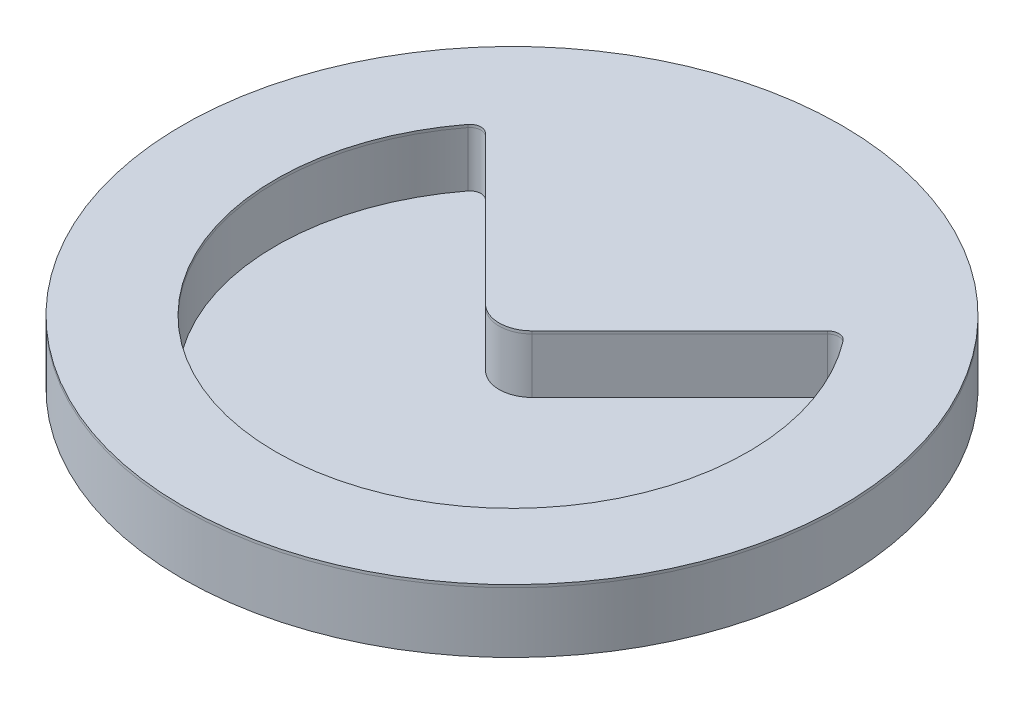
ISO-10303-21;
HEADER;
FILE_DESCRIPTION(('STEP AP214'),'2;1');
FILE_NAME('part.step','',(''),(''),'','','');
FILE_SCHEMA(('AUTOMOTIVE_DESIGN { 1 0 10303 214 1 1 1 1 }'));
ENDSEC;
DATA;
#1=APPLICATION_CONTEXT('core data for automotive mechanical design processes');
#2=APPLICATION_PROTOCOL_DEFINITION('international standard','automotive_design',2000,#1);
#3=PRODUCT_CONTEXT('',#1,'mechanical');
#4=PRODUCT('Part','Part','',(#3));
#5=PRODUCT_RELATED_PRODUCT_CATEGORY('part','',(#4));
#6=PRODUCT_DEFINITION_FORMATION('','',#4);
#7=PRODUCT_DEFINITION_CONTEXT('part definition',#1,'design');
#8=PRODUCT_DEFINITION('design','',#6,#7);
#9=PRODUCT_DEFINITION_SHAPE('','',#8);
#10=(LENGTH_UNIT() NAMED_UNIT(*) SI_UNIT(.MILLI.,.METRE.));
#11=(NAMED_UNIT(*) PLANE_ANGLE_UNIT() SI_UNIT($,.RADIAN.));
#12=(NAMED_UNIT(*) SI_UNIT($,.STERADIAN.) SOLID_ANGLE_UNIT());
#13=UNCERTAINTY_MEASURE_WITH_UNIT(LENGTH_MEASURE(1.E-05),#10,'distance_accuracy_value','');
#14=(GEOMETRIC_REPRESENTATION_CONTEXT(3) GLOBAL_UNCERTAINTY_ASSIGNED_CONTEXT((#13)) GLOBAL_UNIT_ASSIGNED_CONTEXT((#10,
#11,#12)) REPRESENTATION_CONTEXT('',''));
#15=CARTESIAN_POINT('',(0.,0.,0.));
#16=DIRECTION('',(0.,0.,1.));
#17=DIRECTION('',(1.,0.,0.));
#18=AXIS2_PLACEMENT_3D('',#15,#16,#17);
#19=CARTESIAN_POINT('',(0.,10.5,0.));
#20=DIRECTION('',(0.,1.,0.));
#21=DIRECTION('',(0.,0.,1.));
#22=AXIS2_PLACEMENT_3D('',#19,#20,#21);
#23=PLANE('',#22);
#24=CARTESIAN_POINT('',(0.,10.5,0.));
#25=DIRECTION('',(0.,1.,0.));
#26=DIRECTION('',(0.,0.,1.));
#27=AXIS2_PLACEMENT_3D('',#24,#25,#26);
#28=CIRCLE('',#27,60.);
#29=CARTESIAN_POINT('',(0.,10.5,60.));
#30=VERTEX_POINT('',#29);
#31=EDGE_CURVE('E13',#30,#30,#28,.T.);
#32=ORIENTED_EDGE('',*,*,#31,.T.);
#33=EDGE_LOOP('',(#32));
#34=FACE_BOUND('',#33,.T.);
#35=DIRECTION('',(-0.707106781186546,0.,-0.707106781186548));
#36=VECTOR('',#35,1.);
#37=CARTESIAN_POINT('',(-4.24264068711927,10.5,0.585786437626902));
#38=LINE('',#37,#36);
#39=CARTESIAN_POINT('',(-4.24264068711927,10.5,0.585786437626902));
#40=VERTEX_POINT('',#39);
#41=CARTESIAN_POINT('',(-31.1517003305389,10.5,-26.3232732057928));
#42=VERTEX_POINT('',#41);
#43=EDGE_CURVE('E234',#40,#42,#38,.T.);
#44=ORIENTED_EDGE('',*,*,#43,.F.);
#45=CARTESIAN_POINT('',(0.,10.5,-3.65685424949237));
#46=DIRECTION('',(0.,-1.,0.));
#47=DIRECTION('',(0.,0.,1.));
#48=AXIS2_PLACEMENT_3D('',#45,#46,#47);
#49=CIRCLE('',#48,5.99999999999999);
#50=CARTESIAN_POINT('',(4.24264068711929,10.5,0.585786437626899));
#51=VERTEX_POINT('',#50);
#52=EDGE_CURVE('E226',#51,#40,#49,.T.);
#53=ORIENTED_EDGE('',*,*,#52,.F.);
#54=DIRECTION('',(-0.707106781186546,0.,0.707106781186549));
#55=VECTOR('',#54,1.);
#56=CARTESIAN_POINT('',(31.1517003305389,10.5,-26.3232732057928));
#57=LINE('',#56,#55);
#58=CARTESIAN_POINT('',(31.1517003305389,10.5,-26.3232732057928));
#59=VERTEX_POINT('',#58);
#60=EDGE_CURVE('E254',#59,#51,#57,.T.);
#61=ORIENTED_EDGE('',*,*,#60,.F.);
#62=CARTESIAN_POINT('',(32.565913892912,10.5,-24.9090596434197));
#63=DIRECTION('',(0.,1.,0.));
#64=DIRECTION('',(0.,0.,1.));
#65=AXIS2_PLACEMENT_3D('',#62,#63,#64);
#66=CIRCLE('',#65,2.00000000000001);
#67=CARTESIAN_POINT('',(34.1544950584199,10.5,-26.1241357235866));
#68=VERTEX_POINT('',#67);
#69=EDGE_CURVE('E252',#68,#59,#66,.T.);
#70=ORIENTED_EDGE('',*,*,#69,.F.);
#71=CARTESIAN_POINT('',(0.,10.5,0.));
#72=DIRECTION('',(0.,1.,0.));
#73=DIRECTION('',(0.,0.,1.));
#74=AXIS2_PLACEMENT_3D('',#71,#72,#73);
#75=CIRCLE('',#74,43.);
#76=CARTESIAN_POINT('',(-34.1544950584199,10.5,-26.1241357235865));
#77=VERTEX_POINT('',#76);
#78=EDGE_CURVE('E248',#77,#68,#75,.T.);
#79=ORIENTED_EDGE('',*,*,#78,.F.);
#80=CARTESIAN_POINT('',(-32.565913892912,10.5,-24.9090596434197));
#81=DIRECTION('',(0.,1.,0.));
#82=DIRECTION('',(0.,0.,1.));
#83=AXIS2_PLACEMENT_3D('',#80,#81,#82);
#84=CIRCLE('',#83,2.00000000000001);
#85=EDGE_CURVE('E246',#42,#77,#84,.T.);
#86=ORIENTED_EDGE('',*,*,#85,.F.);
#87=EDGE_LOOP('',(#44,#53,#61,#70,#79,#86));
#88=FACE_BOUND('',#87,.T.);
#89=ADVANCED_FACE('F173',(#34,#88),#23,.T.);
#90=CARTESIAN_POINT('',(0.,10.,0.));
#91=DIRECTION('',(0.,1.,0.));
#92=DIRECTION('',(0.,0.,1.));
#93=AXIS2_PLACEMENT_3D('',#90,#91,#92);
#94=PLANE('',#93);
#95=CARTESIAN_POINT('',(0.,10.,0.));
#96=DIRECTION('',(0.,1.,0.));
#97=DIRECTION('',(0.,0.,1.));
#98=AXIS2_PLACEMENT_3D('',#95,#96,#97);
#99=CIRCLE('',#98,60.);
#100=CARTESIAN_POINT('',(0.,10.,60.));
#101=VERTEX_POINT('',#100);
#102=EDGE_CURVE('E177',#101,#101,#99,.T.);
#103=ORIENTED_EDGE('',*,*,#102,.F.);
#104=EDGE_LOOP('',(#103));
#105=FACE_BOUND('',#104,.T.);
#106=CARTESIAN_POINT('',(0.,10.,-3.65685424949237));
#107=DIRECTION('',(0.,-1.,0.));
#108=DIRECTION('',(0.,0.,1.));
#109=AXIS2_PLACEMENT_3D('',#106,#107,#108);
#110=CIRCLE('',#109,5.99999999999999);
#111=CARTESIAN_POINT('',(4.24264068711929,10.,0.585786437626896));
#112=VERTEX_POINT('',#111);
#113=CARTESIAN_POINT('',(-4.24264068711927,10.,0.585786437626902));
#114=VERTEX_POINT('',#113);
#115=EDGE_CURVE('E196',#112,#114,#110,.T.);
#116=ORIENTED_EDGE('',*,*,#115,.T.);
#117=DIRECTION('',(-0.707106781186546,0.,-0.707106781186548));
#118=VECTOR('',#117,1.);
#119=CARTESIAN_POINT('',(-4.24264068711927,10.,0.585786437626902));
#120=LINE('',#119,#118);
#121=CARTESIAN_POINT('',(-31.1517003305389,10.,-26.3232732057928));
#122=VERTEX_POINT('',#121);
#123=EDGE_CURVE('E241',#114,#122,#120,.T.);
#124=ORIENTED_EDGE('',*,*,#123,.T.);
#125=CARTESIAN_POINT('',(-32.565913892912,10.,-24.9090596434197));
#126=DIRECTION('',(0.,1.,0.));
#127=DIRECTION('',(0.,0.,1.));
#128=AXIS2_PLACEMENT_3D('',#125,#126,#127);
#129=CIRCLE('',#128,2.00000000000001);
#130=CARTESIAN_POINT('',(-34.1544950584199,10.,-26.1241357235865));
#131=VERTEX_POINT('',#130);
#132=EDGE_CURVE('E258',#122,#131,#129,.T.);
#133=ORIENTED_EDGE('',*,*,#132,.T.);
#134=CARTESIAN_POINT('',(0.,10.,0.));
#135=DIRECTION('',(0.,1.,0.));
#136=DIRECTION('',(0.,0.,1.));
#137=AXIS2_PLACEMENT_3D('',#134,#135,#136);
#138=CIRCLE('',#137,43.);
#139=CARTESIAN_POINT('',(34.1544950584199,10.,-26.1241357235866));
#140=VERTEX_POINT('',#139);
#141=EDGE_CURVE('E261',#131,#140,#138,.T.);
#142=ORIENTED_EDGE('',*,*,#141,.T.);
#143=CARTESIAN_POINT('',(32.565913892912,10.,-24.9090596434197));
#144=DIRECTION('',(0.,1.,0.));
#145=DIRECTION('',(0.,0.,1.));
#146=AXIS2_PLACEMENT_3D('',#143,#144,#145);
#147=CIRCLE('',#146,2.00000000000001);
#148=CARTESIAN_POINT('',(31.1517003305389,10.,-26.3232732057928));
#149=VERTEX_POINT('',#148);
#150=EDGE_CURVE('E264',#140,#149,#147,.T.);
#151=ORIENTED_EDGE('',*,*,#150,.T.);
#152=DIRECTION('',(-0.707106781186546,0.,0.707106781186549));
#153=VECTOR('',#152,1.);
#154=CARTESIAN_POINT('',(31.1517003305389,10.,-26.3232732057928));
#155=LINE('',#154,#153);
#156=EDGE_CURVE('E235',#149,#112,#155,.T.);
#157=ORIENTED_EDGE('',*,*,#156,.T.);
#158=EDGE_LOOP('',(#116,#124,#133,#142,#151,#157));
#159=FACE_BOUND('',#158,.T.);
#160=ADVANCED_FACE('F281',(#105,#159),#94,.F.);
#161=CARTESIAN_POINT('',(0.,10.5,0.));
#162=DIRECTION('',(0.,-1.,0.));
#163=DIRECTION('',(0.,0.,-1.));
#164=AXIS2_PLACEMENT_3D('',#161,#162,#163);
#165=CYLINDRICAL_SURFACE('',#164,60.);
#166=ORIENTED_EDGE('',*,*,#31,.F.);
#167=EDGE_LOOP('',(#166));
#168=FACE_BOUND('',#167,.T.);
#169=ORIENTED_EDGE('',*,*,#102,.T.);
#170=EDGE_LOOP('',(#169));
#171=FACE_BOUND('',#170,.T.);
#172=ADVANCED_FACE('F175',(#168,#171),#165,.T.);
#173=CARTESIAN_POINT('',(0.,10.5,-3.65685424949237));
#174=DIRECTION('',(0.,-1.,0.));
#175=DIRECTION('',(0.,0.,-1.));
#176=AXIS2_PLACEMENT_3D('',#173,#174,#175);
#177=CYLINDRICAL_SURFACE('',#176,5.99999999999999);
#178=ORIENTED_EDGE('',*,*,#115,.F.);
#179=DIRECTION('',(0.,-1.,0.));
#180=VECTOR('',#179,1.);
#181=CARTESIAN_POINT('',(4.24264068711929,10.5,0.585786437626899));
#182=LINE('',#181,#180);
#183=EDGE_CURVE('E230',#51,#112,#182,.T.);
#184=ORIENTED_EDGE('',*,*,#183,.F.);
#185=ORIENTED_EDGE('',*,*,#52,.T.);
#186=DIRECTION('',(0.,-1.,0.));
#187=VECTOR('',#186,1.);
#188=CARTESIAN_POINT('',(-4.24264068711927,10.5,0.585786437626902));
#189=LINE('',#188,#187);
#190=EDGE_CURVE('E229',#40,#114,#189,.T.);
#191=ORIENTED_EDGE('',*,*,#190,.T.);
#192=EDGE_LOOP('',(#178,#184,#185,#191));
#193=FACE_BOUND('',#192,.T.);
#194=ADVANCED_FACE('F228',(#193),#177,.T.);
#195=CARTESIAN_POINT('',(-4.24264068711927,10.5,0.585786437626902));
#196=DIRECTION('',(-0.707106781186549,0.,0.707106781186547));
#197=DIRECTION('',(0.707106781186546,0.,0.707106781186549));
#198=AXIS2_PLACEMENT_3D('',#195,#196,#197);
#199=PLANE('',#198);
#200=ORIENTED_EDGE('',*,*,#123,.F.);
#201=ORIENTED_EDGE('',*,*,#190,.F.);
#202=ORIENTED_EDGE('',*,*,#43,.T.);
#203=DIRECTION('',(0.,-1.,0.));
#204=VECTOR('',#203,1.);
#205=CARTESIAN_POINT('',(-31.1517003305389,10.5,-26.3232732057928));
#206=LINE('',#205,#204);
#207=EDGE_CURVE('E242',#42,#122,#206,.T.);
#208=ORIENTED_EDGE('',*,*,#207,.T.);
#209=EDGE_LOOP('',(#200,#201,#202,#208));
#210=FACE_BOUND('',#209,.T.);
#211=ADVANCED_FACE('F238',(#210),#199,.T.);
#212=CARTESIAN_POINT('',(-32.565913892912,10.5,-24.9090596434197));
#213=DIRECTION('',(0.,-1.,0.));
#214=DIRECTION('',(0.,0.,-1.));
#215=AXIS2_PLACEMENT_3D('',#212,#213,#214);
#216=CYLINDRICAL_SURFACE('',#215,2.00000000000001);
#217=ORIENTED_EDGE('',*,*,#132,.F.);
#218=ORIENTED_EDGE('',*,*,#207,.F.);
#219=ORIENTED_EDGE('',*,*,#85,.T.);
#220=DIRECTION('',(0.,-1.,0.));
#221=VECTOR('',#220,1.);
#222=CARTESIAN_POINT('',(-34.1544950584199,10.5,-26.1241357235865));
#223=LINE('',#222,#221);
#224=EDGE_CURVE('E273',#77,#131,#223,.T.);
#225=ORIENTED_EDGE('',*,*,#224,.T.);
#226=EDGE_LOOP('',(#217,#218,#219,#225));
#227=FACE_BOUND('',#226,.T.);
#228=ADVANCED_FACE('F277',(#227),#216,.F.);
#229=CARTESIAN_POINT('',(0.,10.5,0.));
#230=DIRECTION('',(0.,-1.,0.));
#231=DIRECTION('',(0.,0.,-1.));
#232=AXIS2_PLACEMENT_3D('',#229,#230,#231);
#233=CYLINDRICAL_SURFACE('',#232,43.);
#234=ORIENTED_EDGE('',*,*,#141,.F.);
#235=ORIENTED_EDGE('',*,*,#224,.F.);
#236=ORIENTED_EDGE('',*,*,#78,.T.);
#237=DIRECTION('',(0.,-1.,0.));
#238=VECTOR('',#237,1.);
#239=CARTESIAN_POINT('',(34.1544950584199,10.5,-26.1241357235866));
#240=LINE('',#239,#238);
#241=EDGE_CURVE('E271',#68,#140,#240,.T.);
#242=ORIENTED_EDGE('',*,*,#241,.T.);
#243=EDGE_LOOP('',(#234,#235,#236,#242));
#244=FACE_BOUND('',#243,.T.);
#245=ADVANCED_FACE('F289',(#244),#233,.F.);
#246=CARTESIAN_POINT('',(32.565913892912,10.5,-24.9090596434197));
#247=DIRECTION('',(0.,-1.,0.));
#248=DIRECTION('',(0.,0.,-1.));
#249=AXIS2_PLACEMENT_3D('',#246,#247,#248);
#250=CYLINDRICAL_SURFACE('',#249,2.00000000000001);
#251=ORIENTED_EDGE('',*,*,#150,.F.);
#252=ORIENTED_EDGE('',*,*,#241,.F.);
#253=ORIENTED_EDGE('',*,*,#69,.T.);
#254=DIRECTION('',(0.,-1.,0.));
#255=VECTOR('',#254,1.);
#256=CARTESIAN_POINT('',(31.1517003305389,10.5,-26.3232732057928));
#257=LINE('',#256,#255);
#258=EDGE_CURVE('E188',#59,#149,#257,.T.);
#259=ORIENTED_EDGE('',*,*,#258,.T.);
#260=EDGE_LOOP('',(#251,#252,#253,#259));
#261=FACE_BOUND('',#260,.T.);
#262=ADVANCED_FACE('F287',(#261),#250,.F.);
#263=CARTESIAN_POINT('',(31.1517003305389,10.5,-26.3232732057928));
#264=DIRECTION('',(0.707106781186549,0.,0.707106781186546));
#265=DIRECTION('',(0.707106781186546,0.,-0.707106781186549));
#266=AXIS2_PLACEMENT_3D('',#263,#264,#265);
#267=PLANE('',#266);
#268=ORIENTED_EDGE('',*,*,#156,.F.);
#269=ORIENTED_EDGE('',*,*,#258,.F.);
#270=ORIENTED_EDGE('',*,*,#60,.T.);
#271=ORIENTED_EDGE('',*,*,#183,.T.);
#272=EDGE_LOOP('',(#268,#269,#270,#271));
#273=FACE_BOUND('',#272,.T.);
#274=ADVANCED_FACE('F283',(#273),#267,.T.);
#275=CLOSED_SHELL('',(#89,#160,#172,#194,#211,#228,#245,#262,#274));
#276=MANIFOLD_SOLID_BREP('B2',#275);
#277=CARTESIAN_POINT('',(0.,10.,0.));
#278=DIRECTION('',(0.,1.,0.));
#279=DIRECTION('',(0.,0.,1.));
#280=AXIS2_PLACEMENT_3D('',#277,#278,#279);
#281=PLANE('',#280);
#282=CARTESIAN_POINT('',(0.,10.,0.));
#283=DIRECTION('',(0.,1.,0.));
#284=DIRECTION('',(0.,0.,1.));
#285=AXIS2_PLACEMENT_3D('',#282,#283,#284);
#286=CIRCLE('',#285,60.);
#287=CARTESIAN_POINT('',(0.,10.,60.));
#288=VERTEX_POINT('',#287);
#289=EDGE_CURVE('E171',#288,#288,#286,.T.);
#290=ORIENTED_EDGE('',*,*,#289,.T.);
#291=EDGE_LOOP('',(#290));
#292=FACE_BOUND('',#291,.T.);
#293=CARTESIAN_POINT('',(0.,10.,0.));
#294=DIRECTION('',(0.,1.,0.));
#295=DIRECTION('',(1.,0.,0.));
#296=AXIS2_PLACEMENT_3D('',#293,#294,#295);
#297=CIRCLE('',#296,58.);
#298=CARTESIAN_POINT('',(58.,10.,0.));
#299=VERTEX_POINT('',#298);
#300=EDGE_CURVE('E378',#299,#299,#297,.T.);
#301=ORIENTED_EDGE('',*,*,#300,.F.);
#302=EDGE_LOOP('',(#301));
#303=FACE_BOUND('',#302,.T.);
#304=ADVANCED_FACE('F370',(#292,#303),#281,.T.);
#305=CARTESIAN_POINT('',(0.,10.,0.));
#306=DIRECTION('',(0.,-1.,0.));
#307=DIRECTION('',(0.,0.,-1.));
#308=AXIS2_PLACEMENT_3D('',#305,#306,#307);
#309=CYLINDRICAL_SURFACE('',#308,60.);
#310=ORIENTED_EDGE('',*,*,#289,.F.);
#311=EDGE_LOOP('',(#310));
#312=FACE_BOUND('',#311,.T.);
#313=CARTESIAN_POINT('',(0.,-1.,0.));
#314=DIRECTION('',(0.,1.,0.));
#315=DIRECTION('',(0.,0.,1.));
#316=AXIS2_PLACEMENT_3D('',#313,#314,#315);
#317=CIRCLE('',#316,60.);
#318=CARTESIAN_POINT('',(0.,-1.,60.));
#319=VERTEX_POINT('',#318);
#320=EDGE_CURVE('E555',#319,#319,#317,.T.);
#321=ORIENTED_EDGE('',*,*,#320,.T.);
#322=EDGE_LOOP('',(#321));
#323=FACE_BOUND('',#322,.T.);
#324=ADVANCED_FACE('F372',(#312,#323),#309,.T.);
#325=CARTESIAN_POINT('',(0.,10.,0.));
#326=DIRECTION('',(0.,-1.,0.));
#327=DIRECTION('',(0.,0.,-1.));
#328=AXIS2_PLACEMENT_3D('',#325,#326,#327);
#329=CYLINDRICAL_SURFACE('',#328,58.);
#330=ORIENTED_EDGE('',*,*,#300,.T.);
#331=EDGE_LOOP('',(#330));
#332=FACE_BOUND('',#331,.T.);
#333=CARTESIAN_POINT('',(0.,0.,0.));
#334=DIRECTION('',(0.,1.,0.));
#335=DIRECTION('',(1.,0.,0.));
#336=AXIS2_PLACEMENT_3D('',#333,#334,#335);
#337=CIRCLE('',#336,58.);
#338=CARTESIAN_POINT('',(58.,0.,0.));
#339=VERTEX_POINT('',#338);
#340=EDGE_CURVE('E558',#339,#339,#337,.T.);
#341=ORIENTED_EDGE('',*,*,#340,.F.);
#342=EDGE_LOOP('',(#341));
#343=FACE_BOUND('',#342,.T.);
#344=ADVANCED_FACE('F565',(#332,#343),#329,.F.);
#345=CARTESIAN_POINT('',(0.,0.,0.));
#346=DIRECTION('',(0.,1.,0.));
#347=DIRECTION('',(0.,0.,1.));
#348=AXIS2_PLACEMENT_3D('',#345,#346,#347);
#349=PLANE('',#348);
#350=DIRECTION('',(-0.707106781186546,0.,0.707106781186549));
#351=VECTOR('',#350,1.);
#352=CARTESIAN_POINT('',(2.82842712474619,0.,-0.828427124746193));
#353=LINE('',#352,#351);
#354=CARTESIAN_POINT('',(29.7374867681658,0.,-27.7374867681659));
#355=VERTEX_POINT('',#354);
#356=CARTESIAN_POINT('',(2.82842712474619,0.,-0.828427124746193));
#357=VERTEX_POINT('',#356);
#358=EDGE_CURVE('E532',#355,#357,#353,.T.);
#359=ORIENTED_EDGE('',*,*,#358,.F.);
#360=CARTESIAN_POINT('',(32.565913892912,0.,-24.9090596434197));
#361=DIRECTION('',(0.,1.,0.));
#362=DIRECTION('',(0.,0.,-1.));
#363=AXIS2_PLACEMENT_3D('',#360,#361,#362);
#364=CIRCLE('',#363,4.00000000000002);
#365=CARTESIAN_POINT('',(35.7430762239278,0.,-27.3392118037534));
#366=VERTEX_POINT('',#365);
#367=EDGE_CURVE('E478',#366,#355,#364,.T.);
#368=ORIENTED_EDGE('',*,*,#367,.F.);
#369=CARTESIAN_POINT('',(0.,0.,0.));
#370=DIRECTION('',(0.,1.,0.));
#371=DIRECTION('',(0.,0.,1.));
#372=AXIS2_PLACEMENT_3D('',#369,#370,#371);
#373=CIRCLE('',#372,45.);
#374=CARTESIAN_POINT('',(-35.7430762239278,0.,-27.3392118037533));
#375=VERTEX_POINT('',#374);
#376=EDGE_CURVE('E519',#375,#366,#373,.T.);
#377=ORIENTED_EDGE('',*,*,#376,.F.);
#378=CARTESIAN_POINT('',(-32.565913892912,0.,-24.9090596434197));
#379=DIRECTION('',(0.,1.,0.));
#380=DIRECTION('',(0.,0.,1.));
#381=AXIS2_PLACEMENT_3D('',#378,#379,#380);
#382=CIRCLE('',#381,4.00000000000002);
#383=CARTESIAN_POINT('',(-29.7374867681658,0.,-27.7374867681659));
#384=VERTEX_POINT('',#383);
#385=EDGE_CURVE('E538',#384,#375,#382,.T.);
#386=ORIENTED_EDGE('',*,*,#385,.F.);
#387=DIRECTION('',(-0.707106781186546,0.,-0.707106781186548));
#388=VECTOR('',#387,1.);
#389=CARTESIAN_POINT('',(-29.7374867681658,0.,-27.7374867681659));
#390=LINE('',#389,#388);
#391=CARTESIAN_POINT('',(-2.82842712474618,0.,-0.828427124746192));
#392=VERTEX_POINT('',#391);
#393=EDGE_CURVE('E536',#392,#384,#390,.T.);
#394=ORIENTED_EDGE('',*,*,#393,.F.);
#395=CARTESIAN_POINT('',(0.,0.,-3.65685424949237));
#396=DIRECTION('',(0.,-1.,0.));
#397=DIRECTION('',(0.,0.,1.));
#398=AXIS2_PLACEMENT_3D('',#395,#396,#397);
#399=CIRCLE('',#398,3.99999999999999);
#400=EDGE_CURVE('E534',#357,#392,#399,.T.);
#401=ORIENTED_EDGE('',*,*,#400,.F.);
#402=EDGE_LOOP('',(#359,#368,#377,#386,#394,#401));
#403=FACE_BOUND('',#402,.T.);
#404=ORIENTED_EDGE('',*,*,#340,.T.);
#405=EDGE_LOOP('',(#404));
#406=FACE_BOUND('',#405,.T.);
#407=ADVANCED_FACE('F563',(#403,#406),#349,.T.);
#408=CARTESIAN_POINT('',(0.,-1.,0.));
#409=DIRECTION('',(0.,1.,0.));
#410=DIRECTION('',(0.,0.,1.));
#411=AXIS2_PLACEMENT_3D('',#408,#409,#410);
#412=PLANE('',#411);
#413=ORIENTED_EDGE('',*,*,#320,.F.);
#414=EDGE_LOOP('',(#413));
#415=FACE_BOUND('',#414,.T.);
#416=ADVANCED_FACE('F573',(#415),#412,.F.);
#417=CARTESIAN_POINT('',(32.565913892912,10.,-24.9090596434197));
#418=DIRECTION('',(0.,1.,0.));
#419=DIRECTION('',(0.,0.,1.));
#420=AXIS2_PLACEMENT_3D('',#417,#418,#419);
#421=PLANE('',#420);
#422=CARTESIAN_POINT('',(32.565913892912,10.,-24.9090596434197));
#423=DIRECTION('',(0.,1.,0.));
#424=DIRECTION('',(0.,0.,-1.));
#425=AXIS2_PLACEMENT_3D('',#422,#423,#424);
#426=CIRCLE('',#425,4.00000000000002);
#427=CARTESIAN_POINT('',(35.7430762239278,10.,-27.3392118037534));
#428=VERTEX_POINT('',#427);
#429=CARTESIAN_POINT('',(29.7374867681658,10.,-27.7374867681659));
#430=VERTEX_POINT('',#429);
#431=EDGE_CURVE('E515',#428,#430,#426,.T.);
#432=ORIENTED_EDGE('',*,*,#431,.T.);
#433=DIRECTION('',(-0.707106781186546,0.,0.707106781186549));
#434=VECTOR('',#433,1.);
#435=CARTESIAN_POINT('',(2.82842712474619,10.,-0.828427124746193));
#436=LINE('',#435,#434);
#437=CARTESIAN_POINT('',(2.82842712474619,10.,-0.828427124746193));
#438=VERTEX_POINT('',#437);
#439=EDGE_CURVE('E518',#430,#438,#436,.T.);
#440=ORIENTED_EDGE('',*,*,#439,.T.);
#441=CARTESIAN_POINT('',(0.,10.,-3.65685424949237));
#442=DIRECTION('',(0.,-1.,0.));
#443=DIRECTION('',(0.,0.,1.));
#444=AXIS2_PLACEMENT_3D('',#441,#442,#443);
#445=CIRCLE('',#444,3.99999999999999);
#446=CARTESIAN_POINT('',(-2.82842712474618,10.,-0.828427124746192));
#447=VERTEX_POINT('',#446);
#448=EDGE_CURVE('E521',#438,#447,#445,.T.);
#449=ORIENTED_EDGE('',*,*,#448,.T.);
#450=DIRECTION('',(-0.707106781186546,0.,-0.707106781186548));
#451=VECTOR('',#450,1.);
#452=CARTESIAN_POINT('',(-29.7374867681658,10.,-27.7374867681659));
#453=LINE('',#452,#451);
#454=CARTESIAN_POINT('',(-29.7374867681658,10.,-27.7374867681659));
#455=VERTEX_POINT('',#454);
#456=EDGE_CURVE('E523',#447,#455,#453,.T.);
#457=ORIENTED_EDGE('',*,*,#456,.T.);
#458=CARTESIAN_POINT('',(-32.565913892912,10.,-24.9090596434197));
#459=DIRECTION('',(0.,1.,0.));
#460=DIRECTION('',(0.,0.,1.));
#461=AXIS2_PLACEMENT_3D('',#458,#459,#460);
#462=CIRCLE('',#461,4.00000000000002);
#463=CARTESIAN_POINT('',(-35.7430762239278,10.,-27.3392118037533));
#464=VERTEX_POINT('',#463);
#465=EDGE_CURVE('E525',#455,#464,#462,.T.);
#466=ORIENTED_EDGE('',*,*,#465,.T.);
#467=CARTESIAN_POINT('',(0.,10.,0.));
#468=DIRECTION('',(0.,1.,0.));
#469=DIRECTION('',(0.,0.,1.));
#470=AXIS2_PLACEMENT_3D('',#467,#468,#469);
#471=CIRCLE('',#470,45.);
#472=EDGE_CURVE('E527',#464,#428,#471,.T.);
#473=ORIENTED_EDGE('',*,*,#472,.T.);
#474=EDGE_LOOP('',(#432,#440,#449,#457,#466,#473));
#475=FACE_BOUND('',#474,.T.);
#476=DIRECTION('',(-0.707106781186546,0.,0.707106781186549));
#477=VECTOR('',#476,1.);
#478=CARTESIAN_POINT('',(31.1517003305389,10.,-26.3232732057928));
#479=LINE('',#478,#477);
#480=CARTESIAN_POINT('',(31.1517003305389,10.,-26.3232732057928));
#481=VERTEX_POINT('',#480);
#482=CARTESIAN_POINT('',(4.24264068711929,10.,0.585786437626899));
#483=VERTEX_POINT('',#482);
#484=EDGE_CURVE('E470',#481,#483,#479,.T.);
#485=ORIENTED_EDGE('',*,*,#484,.F.);
#486=CARTESIAN_POINT('',(32.565913892912,10.,-24.9090596434197));
#487=DIRECTION('',(0.,-1.,0.));
#488=DIRECTION('',(-1.,0.,0.));
#489=AXIS2_PLACEMENT_3D('',#486,#487,#488);
#490=CIRCLE('',#489,2.00000000000002);
#491=CARTESIAN_POINT('',(34.1544950584199,10.,-26.1241357235866));
#492=VERTEX_POINT('',#491);
#493=EDGE_CURVE('E461',#492,#481,#490,.F.);
#494=ORIENTED_EDGE('',*,*,#493,.F.);
#495=CARTESIAN_POINT('',(0.,10.,0.));
#496=DIRECTION('',(0.,-1.,0.));
#497=DIRECTION('',(-1.,0.,0.));
#498=AXIS2_PLACEMENT_3D('',#495,#496,#497);
#499=CIRCLE('',#498,43.);
#500=CARTESIAN_POINT('',(-34.1544950584199,10.,-26.1241357235865));
#501=VERTEX_POINT('',#500);
#502=EDGE_CURVE('E493',#501,#492,#499,.F.);
#503=ORIENTED_EDGE('',*,*,#502,.F.);
#504=CARTESIAN_POINT('',(-32.565913892912,10.,-24.9090596434197));
#505=DIRECTION('',(0.,-1.,0.));
#506=DIRECTION('',(-1.,0.,0.));
#507=AXIS2_PLACEMENT_3D('',#504,#505,#506);
#508=CIRCLE('',#507,2.00000000000002);
#509=CARTESIAN_POINT('',(-31.1517003305389,10.,-26.3232732057928));
#510=VERTEX_POINT('',#509);
#511=EDGE_CURVE('E490',#510,#501,#508,.F.);
#512=ORIENTED_EDGE('',*,*,#511,.F.);
#513=DIRECTION('',(-0.707106781186546,0.,-0.707106781186549));
#514=VECTOR('',#513,1.);
#515=CARTESIAN_POINT('',(1.41421356237301,10.,6.24264068711921));
#516=LINE('',#515,#514);
#517=CARTESIAN_POINT('',(-4.24264068711927,10.,0.585786437626902));
#518=VERTEX_POINT('',#517);
#519=EDGE_CURVE('E486',#518,#510,#516,.T.);
#520=ORIENTED_EDGE('',*,*,#519,.F.);
#521=CARTESIAN_POINT('',(0.,10.,-3.65685424949237));
#522=DIRECTION('',(0.,-1.,0.));
#523=DIRECTION('',(-1.,0.,0.));
#524=AXIS2_PLACEMENT_3D('',#521,#522,#523);
#525=CIRCLE('',#524,5.99999999999999);
#526=EDGE_CURVE('E484',#483,#518,#525,.T.);
#527=ORIENTED_EDGE('',*,*,#526,.F.);
#528=EDGE_LOOP('',(#485,#494,#503,#512,#520,#527));
#529=FACE_BOUND('',#528,.T.);
#530=ADVANCED_FACE('F482',(#475,#529),#421,.T.);
#531=CARTESIAN_POINT('',(32.565913892912,10.,-24.9090596434197));
#532=DIRECTION('',(0.,-1.,0.));
#533=DIRECTION('',(0.,0.,-1.));
#534=AXIS2_PLACEMENT_3D('',#531,#532,#533);
#535=CYLINDRICAL_SURFACE('',#534,4.00000000000002);
#536=ORIENTED_EDGE('',*,*,#367,.T.);
#537=DIRECTION('',(0.,-1.,0.));
#538=VECTOR('',#537,1.);
#539=CARTESIAN_POINT('',(29.7374867681658,10.,-27.7374867681659));
#540=LINE('',#539,#538);
#541=EDGE_CURVE('E553',#430,#355,#540,.T.);
#542=ORIENTED_EDGE('',*,*,#541,.F.);
#543=ORIENTED_EDGE('',*,*,#431,.F.);
#544=DIRECTION('',(0.,-1.,0.));
#545=VECTOR('',#544,1.);
#546=CARTESIAN_POINT('',(35.7430762239278,10.,-27.3392118037534));
#547=LINE('',#546,#545);
#548=EDGE_CURVE('E529',#428,#366,#547,.T.);
#549=ORIENTED_EDGE('',*,*,#548,.T.);
#550=EDGE_LOOP('',(#536,#542,#543,#549));
#551=FACE_BOUND('',#550,.T.);
#552=ADVANCED_FACE('F593',(#551),#535,.T.);
#553=CARTESIAN_POINT('',(2.82842712474619,10.,-0.828427124746193));
#554=DIRECTION('',(0.707106781186549,0.,0.707106781186546));
#555=DIRECTION('',(0.707106781186546,0.,-0.707106781186549));
#556=AXIS2_PLACEMENT_3D('',#553,#554,#555);
#557=PLANE('',#556);
#558=ORIENTED_EDGE('',*,*,#358,.T.);
#559=DIRECTION('',(0.,-1.,0.));
#560=VECTOR('',#559,1.);
#561=CARTESIAN_POINT('',(2.82842712474619,10.,-0.828427124746193));
#562=LINE('',#561,#560);
#563=EDGE_CURVE('E550',#438,#357,#562,.T.);
#564=ORIENTED_EDGE('',*,*,#563,.F.);
#565=ORIENTED_EDGE('',*,*,#439,.F.);
#566=ORIENTED_EDGE('',*,*,#541,.T.);
#567=EDGE_LOOP('',(#558,#564,#565,#566));
#568=FACE_BOUND('',#567,.T.);
#569=ADVANCED_FACE('F599',(#568),#557,.F.);
#570=CARTESIAN_POINT('',(0.,10.,-3.65685424949237));
#571=DIRECTION('',(0.,-1.,0.));
#572=DIRECTION('',(0.,0.,-1.));
#573=AXIS2_PLACEMENT_3D('',#570,#571,#572);
#574=CYLINDRICAL_SURFACE('',#573,3.99999999999999);
#575=ORIENTED_EDGE('',*,*,#400,.T.);
#576=DIRECTION('',(0.,-1.,0.));
#577=VECTOR('',#576,1.);
#578=CARTESIAN_POINT('',(-2.82842712474618,10.,-0.828427124746192));
#579=LINE('',#578,#577);
#580=EDGE_CURVE('E547',#447,#392,#579,.T.);
#581=ORIENTED_EDGE('',*,*,#580,.F.);
#582=ORIENTED_EDGE('',*,*,#448,.F.);
#583=ORIENTED_EDGE('',*,*,#563,.T.);
#584=EDGE_LOOP('',(#575,#581,#582,#583));
#585=FACE_BOUND('',#584,.T.);
#586=ADVANCED_FACE('F603',(#585),#574,.F.);
#587=CARTESIAN_POINT('',(-29.7374867681658,10.,-27.7374867681659));
#588=DIRECTION('',(-0.707106781186548,0.,0.707106781186546));
#589=DIRECTION('',(0.707106781186547,0.,0.707106781186549));
#590=AXIS2_PLACEMENT_3D('',#587,#588,#589);
#591=PLANE('',#590);
#592=ORIENTED_EDGE('',*,*,#393,.T.);
#593=DIRECTION('',(0.,-1.,0.));
#594=VECTOR('',#593,1.);
#595=CARTESIAN_POINT('',(-29.7374867681658,10.,-27.7374867681659));
#596=LINE('',#595,#594);
#597=EDGE_CURVE('E544',#455,#384,#596,.T.);
#598=ORIENTED_EDGE('',*,*,#597,.F.);
#599=ORIENTED_EDGE('',*,*,#456,.F.);
#600=ORIENTED_EDGE('',*,*,#580,.T.);
#601=EDGE_LOOP('',(#592,#598,#599,#600));
#602=FACE_BOUND('',#601,.T.);
#603=ADVANCED_FACE('F607',(#602),#591,.F.);
#604=CARTESIAN_POINT('',(-32.565913892912,10.,-24.9090596434197));
#605=DIRECTION('',(0.,-1.,0.));
#606=DIRECTION('',(0.,0.,-1.));
#607=AXIS2_PLACEMENT_3D('',#604,#605,#606);
#608=CYLINDRICAL_SURFACE('',#607,4.00000000000002);
#609=ORIENTED_EDGE('',*,*,#385,.T.);
#610=DIRECTION('',(0.,-1.,0.));
#611=VECTOR('',#610,1.);
#612=CARTESIAN_POINT('',(-35.7430762239278,10.,-27.3392118037533));
#613=LINE('',#612,#611);
#614=EDGE_CURVE('E385',#464,#375,#613,.T.);
#615=ORIENTED_EDGE('',*,*,#614,.F.);
#616=ORIENTED_EDGE('',*,*,#465,.F.);
#617=ORIENTED_EDGE('',*,*,#597,.T.);
#618=EDGE_LOOP('',(#609,#615,#616,#617));
#619=FACE_BOUND('',#618,.T.);
#620=ADVANCED_FACE('F611',(#619),#608,.T.);
#621=CARTESIAN_POINT('',(0.,10.,0.));
#622=DIRECTION('',(0.,-1.,0.));
#623=DIRECTION('',(0.,0.,-1.));
#624=AXIS2_PLACEMENT_3D('',#621,#622,#623);
#625=CYLINDRICAL_SURFACE('',#624,45.);
#626=ORIENTED_EDGE('',*,*,#376,.T.);
#627=ORIENTED_EDGE('',*,*,#548,.F.);
#628=ORIENTED_EDGE('',*,*,#472,.F.);
#629=ORIENTED_EDGE('',*,*,#614,.T.);
#630=EDGE_LOOP('',(#626,#627,#628,#629));
#631=FACE_BOUND('',#630,.T.);
#632=ADVANCED_FACE('F615',(#631),#625,.T.);
#633=CARTESIAN_POINT('',(32.565913892912,10.,-24.9090596434197));
#634=DIRECTION('',(0.,-1.,0.));
#635=DIRECTION('',(0.,0.,-1.));
#636=AXIS2_PLACEMENT_3D('',#633,#634,#635);
#637=CYLINDRICAL_SURFACE('',#636,2.00000000000002);
#638=CARTESIAN_POINT('',(32.565913892912,0.,-24.9090596434197));
#639=DIRECTION('',(0.,-1.,0.));
#640=DIRECTION('',(-1.,0.,0.));
#641=AXIS2_PLACEMENT_3D('',#638,#639,#640);
#642=CIRCLE('',#641,2.00000000000002);
#643=CARTESIAN_POINT('',(34.1544950584199,0.,-26.1241357235866));
#644=VERTEX_POINT('',#643);
#645=CARTESIAN_POINT('',(31.1517003305389,0.,-26.3232732057928));
#646=VERTEX_POINT('',#645);
#647=EDGE_CURVE('E393',#644,#646,#642,.F.);
#648=ORIENTED_EDGE('',*,*,#647,.F.);
#649=DIRECTION('',(0.,-1.,0.));
#650=VECTOR('',#649,1.);
#651=CARTESIAN_POINT('',(34.1544950584199,10.,-26.1241357235866));
#652=LINE('',#651,#650);
#653=EDGE_CURVE('E466',#492,#644,#652,.T.);
#654=ORIENTED_EDGE('',*,*,#653,.F.);
#655=ORIENTED_EDGE('',*,*,#493,.T.);
#656=DIRECTION('',(0.,-1.,0.));
#657=VECTOR('',#656,1.);
#658=CARTESIAN_POINT('',(31.1517003305389,10.,-26.3232732057928));
#659=LINE('',#658,#657);
#660=EDGE_CURVE('E464',#481,#646,#659,.T.);
#661=ORIENTED_EDGE('',*,*,#660,.T.);
#662=EDGE_LOOP('',(#648,#654,#655,#661));
#663=FACE_BOUND('',#662,.T.);
#664=ADVANCED_FACE('F463',(#663),#637,.F.);
#665=CARTESIAN_POINT('',(31.1517003305389,10.,-26.3232732057928));
#666=DIRECTION('',(0.707106781186549,0.,0.707106781186546));
#667=DIRECTION('',(0.707106781186546,0.,-0.707106781186549));
#668=AXIS2_PLACEMENT_3D('',#665,#666,#667);
#669=PLANE('',#668);
#670=DIRECTION('',(-0.707106781186546,0.,0.707106781186549));
#671=VECTOR('',#670,1.);
#672=CARTESIAN_POINT('',(31.1517003305389,0.,-26.3232732057928));
#673=LINE('',#672,#671);
#674=CARTESIAN_POINT('',(4.24264068711929,0.,0.585786437626899));
#675=VERTEX_POINT('',#674);
#676=EDGE_CURVE('E477',#646,#675,#673,.T.);
#677=ORIENTED_EDGE('',*,*,#676,.F.);
#678=ORIENTED_EDGE('',*,*,#660,.F.);
#679=ORIENTED_EDGE('',*,*,#484,.T.);
#680=DIRECTION('',(0.,-1.,0.));
#681=VECTOR('',#680,1.);
#682=CARTESIAN_POINT('',(4.24264068711929,10.,0.585786437626899));
#683=LINE('',#682,#681);
#684=EDGE_CURVE('E479',#483,#675,#683,.T.);
#685=ORIENTED_EDGE('',*,*,#684,.T.);
#686=EDGE_LOOP('',(#677,#678,#679,#685));
#687=FACE_BOUND('',#686,.T.);
#688=ADVANCED_FACE('F474',(#687),#669,.T.);
#689=CARTESIAN_POINT('',(0.,10.,-3.65685424949237));
#690=DIRECTION('',(0.,-1.,0.));
#691=DIRECTION('',(0.,0.,-1.));
#692=AXIS2_PLACEMENT_3D('',#689,#690,#691);
#693=CYLINDRICAL_SURFACE('',#692,5.99999999999999);
#694=CARTESIAN_POINT('',(0.,0.,-3.65685424949237));
#695=DIRECTION('',(0.,-1.,0.));
#696=DIRECTION('',(-1.,0.,0.));
#697=AXIS2_PLACEMENT_3D('',#694,#695,#696);
#698=CIRCLE('',#697,5.99999999999999);
#699=CARTESIAN_POINT('',(-4.24264068711928,0.,0.585786437626902));
#700=VERTEX_POINT('',#699);
#701=EDGE_CURVE('E497',#675,#700,#698,.T.);
#702=ORIENTED_EDGE('',*,*,#701,.F.);
#703=ORIENTED_EDGE('',*,*,#684,.F.);
#704=ORIENTED_EDGE('',*,*,#526,.T.);
#705=DIRECTION('',(0.,-1.,0.));
#706=VECTOR('',#705,1.);
#707=CARTESIAN_POINT('',(-4.24264068711927,10.,0.585786437626902));
#708=LINE('',#707,#706);
#709=EDGE_CURVE('E511',#518,#700,#708,.T.);
#710=ORIENTED_EDGE('',*,*,#709,.T.);
#711=EDGE_LOOP('',(#702,#703,#704,#710));
#712=FACE_BOUND('',#711,.T.);
#713=ADVANCED_FACE('F623',(#712),#693,.T.);
#714=CARTESIAN_POINT('',(1.41421356237301,10.,6.24264068711921));
#715=DIRECTION('',(-0.707106781186549,0.,0.707106781186546));
#716=DIRECTION('',(0.707106781186546,0.,0.707106781186549));
#717=AXIS2_PLACEMENT_3D('',#714,#715,#716);
#718=PLANE('',#717);
#719=DIRECTION('',(-0.707106781186546,0.,-0.707106781186549));
#720=VECTOR('',#719,1.);
#721=CARTESIAN_POINT('',(1.41421356237301,0.,6.24264068711921));
#722=LINE('',#721,#720);
#723=CARTESIAN_POINT('',(-31.1517003305389,0.,-26.3232732057928));
#724=VERTEX_POINT('',#723);
#725=EDGE_CURVE('E499',#700,#724,#722,.T.);
#726=ORIENTED_EDGE('',*,*,#725,.F.);
#727=ORIENTED_EDGE('',*,*,#709,.F.);
#728=ORIENTED_EDGE('',*,*,#519,.T.);
#729=DIRECTION('',(0.,-1.,0.));
#730=VECTOR('',#729,1.);
#731=CARTESIAN_POINT('',(-31.1517003305389,10.,-26.3232732057928));
#732=LINE('',#731,#730);
#733=EDGE_CURVE('E508',#510,#724,#732,.T.);
#734=ORIENTED_EDGE('',*,*,#733,.T.);
#735=EDGE_LOOP('',(#726,#727,#728,#734));
#736=FACE_BOUND('',#735,.T.);
#737=ADVANCED_FACE('F626',(#736),#718,.T.);
#738=CARTESIAN_POINT('',(-32.565913892912,10.,-24.9090596434197));
#739=DIRECTION('',(0.,-1.,0.));
#740=DIRECTION('',(0.,0.,-1.));
#741=AXIS2_PLACEMENT_3D('',#738,#739,#740);
#742=CYLINDRICAL_SURFACE('',#741,2.00000000000002);
#743=CARTESIAN_POINT('',(-32.565913892912,0.,-24.9090596434197));
#744=DIRECTION('',(0.,-1.,0.));
#745=DIRECTION('',(-1.,0.,0.));
#746=AXIS2_PLACEMENT_3D('',#743,#744,#745);
#747=CIRCLE('',#746,2.00000000000002);
#748=CARTESIAN_POINT('',(-34.1544950584199,0.,-26.1241357235865));
#749=VERTEX_POINT('',#748);
#750=EDGE_CURVE('E501',#724,#749,#747,.F.);
#751=ORIENTED_EDGE('',*,*,#750,.F.);
#752=ORIENTED_EDGE('',*,*,#733,.F.);
#753=ORIENTED_EDGE('',*,*,#511,.T.);
#754=DIRECTION('',(0.,-1.,0.));
#755=VECTOR('',#754,1.);
#756=CARTESIAN_POINT('',(-34.1544950584199,10.,-26.1241357235865));
#757=LINE('',#756,#755);
#758=EDGE_CURVE('E505',#501,#749,#757,.T.);
#759=ORIENTED_EDGE('',*,*,#758,.T.);
#760=EDGE_LOOP('',(#751,#752,#753,#759));
#761=FACE_BOUND('',#760,.T.);
#762=ADVANCED_FACE('F630',(#761),#742,.F.);
#763=CARTESIAN_POINT('',(0.,10.,0.));
#764=DIRECTION('',(0.,-1.,0.));
#765=DIRECTION('',(0.,0.,-1.));
#766=AXIS2_PLACEMENT_3D('',#763,#764,#765);
#767=CYLINDRICAL_SURFACE('',#766,43.);
#768=CARTESIAN_POINT('',(0.,0.,0.));
#769=DIRECTION('',(0.,-1.,0.));
#770=DIRECTION('',(-1.,0.,0.));
#771=AXIS2_PLACEMENT_3D('',#768,#769,#770);
#772=CIRCLE('',#771,43.);
#773=EDGE_CURVE('E471',#749,#644,#772,.F.);
#774=ORIENTED_EDGE('',*,*,#773,.F.);
#775=ORIENTED_EDGE('',*,*,#758,.F.);
#776=ORIENTED_EDGE('',*,*,#502,.T.);
#777=ORIENTED_EDGE('',*,*,#653,.T.);
#778=EDGE_LOOP('',(#774,#775,#776,#777));
#779=FACE_BOUND('',#778,.T.);
#780=ADVANCED_FACE('F634',(#779),#767,.F.);
#781=ORIENTED_EDGE('',*,*,#647,.T.);
#782=ORIENTED_EDGE('',*,*,#676,.T.);
#783=ORIENTED_EDGE('',*,*,#701,.T.);
#784=ORIENTED_EDGE('',*,*,#725,.T.);
#785=ORIENTED_EDGE('',*,*,#750,.T.);
#786=ORIENTED_EDGE('',*,*,#773,.T.);
#787=EDGE_LOOP('',(#781,#782,#783,#784,#785,#786));
#788=FACE_BOUND('',#787,.T.);
#789=ADVANCED_FACE('F576',(#788),#349,.T.);
#790=CLOSED_SHELL('',(#304,#324,#344,#407,#416,#530,#552,#569,#586,#603,#620,#632,#664,#688,
#713,#737,#762,#780,#789));
#791=MANIFOLD_SOLID_BREP('B7',#790);
#792=ADVANCED_BREP_SHAPE_REPRESENTATION('',(#18,#276,#791),#14);
#793=SHAPE_DEFINITION_REPRESENTATION(#9,#792);
ENDSEC;
END-ISO-10303-21;
